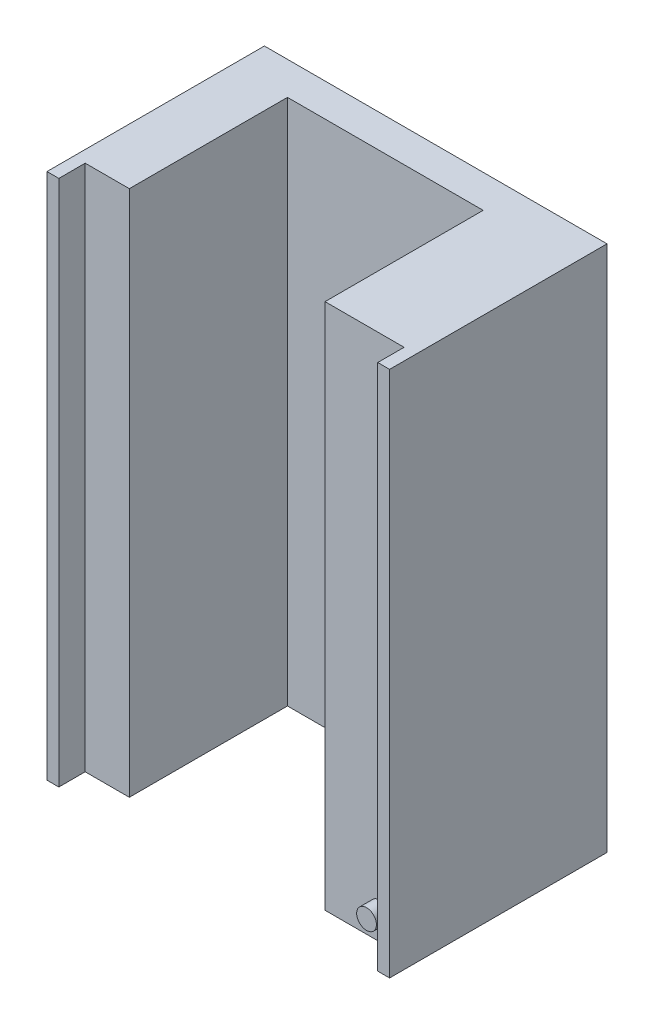
ISO-10303-21;
HEADER;
FILE_DESCRIPTION(('STEP AP214'),'2;1');
FILE_NAME('part.step','',(''),(''),'','','');
FILE_SCHEMA(('AUTOMOTIVE_DESIGN { 1 0 10303 214 1 1 1 1 }'));
ENDSEC;
DATA;
#1=APPLICATION_CONTEXT('core data for automotive mechanical design processes');
#2=APPLICATION_PROTOCOL_DEFINITION('international standard','automotive_design',2000,#1);
#3=PRODUCT_CONTEXT('',#1,'mechanical');
#4=PRODUCT('Part','Part','',(#3));
#5=PRODUCT_RELATED_PRODUCT_CATEGORY('part','',(#4));
#6=PRODUCT_DEFINITION_FORMATION('','',#4);
#7=PRODUCT_DEFINITION_CONTEXT('part definition',#1,'design');
#8=PRODUCT_DEFINITION('design','',#6,#7);
#9=PRODUCT_DEFINITION_SHAPE('','',#8);
#10=(LENGTH_UNIT() NAMED_UNIT(*) SI_UNIT(.MILLI.,.METRE.));
#11=(NAMED_UNIT(*) PLANE_ANGLE_UNIT() SI_UNIT($,.RADIAN.));
#12=(NAMED_UNIT(*) SI_UNIT($,.STERADIAN.) SOLID_ANGLE_UNIT());
#13=UNCERTAINTY_MEASURE_WITH_UNIT(LENGTH_MEASURE(1.E-05),#10,'distance_accuracy_value','');
#14=(GEOMETRIC_REPRESENTATION_CONTEXT(3) GLOBAL_UNCERTAINTY_ASSIGNED_CONTEXT((#13)) GLOBAL_UNIT_ASSIGNED_CONTEXT((#10,
#11,#12)) REPRESENTATION_CONTEXT('',''));
#15=CARTESIAN_POINT('',(0.,0.,0.));
#16=DIRECTION('',(0.,0.,1.));
#17=DIRECTION('',(1.,0.,0.));
#18=AXIS2_PLACEMENT_3D('',#15,#16,#17);
#19=CARTESIAN_POINT('',(-25.,40.,-14.5));
#20=DIRECTION('',(1.,0.,0.));
#21=DIRECTION('',(0.,0.,-1.));
#22=AXIS2_PLACEMENT_3D('',#19,#20,#21);
#23=PLANE('',#22);
#24=DIRECTION('',(0.,0.,1.));
#25=VECTOR('',#24,1.);
#26=CARTESIAN_POINT('',(-25.,0.,-14.5));
#27=LINE('',#26,#25);
#28=CARTESIAN_POINT('',(-25.,0.,-14.5));
#29=VERTEX_POINT('',#28);
#30=CARTESIAN_POINT('',(-25.,0.,2.00000000000001));
#31=VERTEX_POINT('',#30);
#32=EDGE_CURVE('E154',#29,#31,#27,.T.);
#33=ORIENTED_EDGE('',*,*,#32,.T.);
#34=DIRECTION('',(0.,-1.,0.));
#35=VECTOR('',#34,1.);
#36=CARTESIAN_POINT('',(-25.,40.,2.00000000000001));
#37=LINE('',#36,#35);
#38=CARTESIAN_POINT('',(-25.,40.,2.00000000000001));
#39=VERTEX_POINT('',#38);
#40=EDGE_CURVE('E41',#39,#31,#37,.T.);
#41=ORIENTED_EDGE('',*,*,#40,.F.);
#42=DIRECTION('',(0.,0.,1.));
#43=VECTOR('',#42,1.);
#44=CARTESIAN_POINT('',(-25.,40.,-14.5));
#45=LINE('',#44,#43);
#46=CARTESIAN_POINT('',(-25.,40.,-14.5));
#47=VERTEX_POINT('',#46);
#48=EDGE_CURVE('E177',#47,#39,#45,.T.);
#49=ORIENTED_EDGE('',*,*,#48,.F.);
#50=DIRECTION('',(0.,-1.,0.));
#51=VECTOR('',#50,1.);
#52=CARTESIAN_POINT('',(-25.,40.,-14.5));
#53=LINE('',#52,#51);
#54=EDGE_CURVE('E150',#47,#29,#53,.T.);
#55=ORIENTED_EDGE('',*,*,#54,.T.);
#56=EDGE_LOOP('',(#33,#41,#49,#55));
#57=FACE_BOUND('',#56,.T.);
#58=ADVANCED_FACE('F33',(#57),#23,.F.);
#59=CARTESIAN_POINT('',(-24.1,40.,2.00000000000001));
#60=DIRECTION('',(0.,0.,-1.));
#61=DIRECTION('',(-1.,0.,0.));
#62=AXIS2_PLACEMENT_3D('',#59,#60,#61);
#63=PLANE('',#62);
#64=DIRECTION('',(1.,0.,0.));
#65=VECTOR('',#64,1.);
#66=CARTESIAN_POINT('',(-24.1,0.,2.00000000000001));
#67=LINE('',#66,#65);
#68=CARTESIAN_POINT('',(-24.1,0.,2.00000000000001));
#69=VERTEX_POINT('',#68);
#70=EDGE_CURVE('E157',#31,#69,#67,.T.);
#71=ORIENTED_EDGE('',*,*,#70,.T.);
#72=DIRECTION('',(0.,-1.,0.));
#73=VECTOR('',#72,1.);
#74=CARTESIAN_POINT('',(-24.1,40.,2.00000000000001));
#75=LINE('',#74,#73);
#76=CARTESIAN_POINT('',(-24.1,40.,2.00000000000001));
#77=VERTEX_POINT('',#76);
#78=EDGE_CURVE('E199',#77,#69,#75,.T.);
#79=ORIENTED_EDGE('',*,*,#78,.F.);
#80=DIRECTION('',(1.,0.,0.));
#81=VECTOR('',#80,1.);
#82=CARTESIAN_POINT('',(-24.1,40.,2.00000000000001));
#83=LINE('',#82,#81);
#84=EDGE_CURVE('E105',#39,#77,#83,.T.);
#85=ORIENTED_EDGE('',*,*,#84,.F.);
#86=ORIENTED_EDGE('',*,*,#40,.T.);
#87=EDGE_LOOP('',(#71,#79,#85,#86));
#88=FACE_BOUND('',#87,.T.);
#89=ADVANCED_FACE('F202',(#88),#63,.F.);
#90=CARTESIAN_POINT('',(-24.1,40.,0.));
#91=DIRECTION('',(-1.,0.,0.));
#92=DIRECTION('',(0.,0.,1.));
#93=AXIS2_PLACEMENT_3D('',#90,#91,#92);
#94=PLANE('',#93);
#95=DIRECTION('',(0.,0.,-1.));
#96=VECTOR('',#95,1.);
#97=CARTESIAN_POINT('',(-24.1,0.,0.));
#98=LINE('',#97,#96);
#99=CARTESIAN_POINT('',(-24.1,0.,0.));
#100=VERTEX_POINT('',#99);
#101=EDGE_CURVE('E160',#69,#100,#98,.T.);
#102=ORIENTED_EDGE('',*,*,#101,.T.);
#103=DIRECTION('',(0.,-1.,0.));
#104=VECTOR('',#103,1.);
#105=CARTESIAN_POINT('',(-24.1,40.,0.));
#106=LINE('',#105,#104);
#107=CARTESIAN_POINT('',(-24.1,40.,0.));
#108=VERTEX_POINT('',#107);
#109=EDGE_CURVE('E196',#108,#100,#106,.T.);
#110=ORIENTED_EDGE('',*,*,#109,.F.);
#111=DIRECTION('',(0.,0.,-1.));
#112=VECTOR('',#111,1.);
#113=CARTESIAN_POINT('',(-24.1,40.,0.));
#114=LINE('',#113,#112);
#115=EDGE_CURVE('E222',#77,#108,#114,.T.);
#116=ORIENTED_EDGE('',*,*,#115,.F.);
#117=ORIENTED_EDGE('',*,*,#78,.T.);
#118=EDGE_LOOP('',(#102,#110,#116,#117));
#119=FACE_BOUND('',#118,.T.);
#120=ADVANCED_FACE('F213',(#119),#94,.F.);
#121=CARTESIAN_POINT('',(-24.1,40.,0.));
#122=DIRECTION('',(0.,0.,-1.));
#123=DIRECTION('',(-1.,0.,0.));
#124=AXIS2_PLACEMENT_3D('',#121,#122,#123);
#125=PLANE('',#124);
#126=DIRECTION('',(1.,0.,0.));
#127=VECTOR('',#126,1.);
#128=CARTESIAN_POINT('',(-24.1,0.,0.));
#129=LINE('',#128,#127);
#130=CARTESIAN_POINT('',(-20.75,0.,0.));
#131=VERTEX_POINT('',#130);
#132=EDGE_CURVE('E162',#100,#131,#129,.T.);
#133=ORIENTED_EDGE('',*,*,#132,.T.);
#134=DIRECTION('',(0.,-1.,0.));
#135=VECTOR('',#134,1.);
#136=CARTESIAN_POINT('',(-20.75,40.,0.));
#137=LINE('',#136,#135);
#138=CARTESIAN_POINT('',(-20.75,40.,0.));
#139=VERTEX_POINT('',#138);
#140=EDGE_CURVE('E193',#139,#131,#137,.T.);
#141=ORIENTED_EDGE('',*,*,#140,.F.);
#142=DIRECTION('',(1.,0.,0.));
#143=VECTOR('',#142,1.);
#144=CARTESIAN_POINT('',(-24.1,40.,0.));
#145=LINE('',#144,#143);
#146=EDGE_CURVE('E219',#108,#139,#145,.T.);
#147=ORIENTED_EDGE('',*,*,#146,.F.);
#148=ORIENTED_EDGE('',*,*,#109,.T.);
#149=EDGE_LOOP('',(#133,#141,#147,#148));
#150=FACE_BOUND('',#149,.T.);
#151=ADVANCED_FACE('F217',(#150),#125,.F.);
#152=CARTESIAN_POINT('',(-20.75,40.,0.));
#153=DIRECTION('',(-1.,0.,0.));
#154=DIRECTION('',(0.,0.,1.));
#155=AXIS2_PLACEMENT_3D('',#152,#153,#154);
#156=PLANE('',#155);
#157=DIRECTION('',(0.,0.,-1.));
#158=VECTOR('',#157,1.);
#159=CARTESIAN_POINT('',(-20.75,0.,0.));
#160=LINE('',#159,#158);
#161=CARTESIAN_POINT('',(-20.75,0.,-12.));
#162=VERTEX_POINT('',#161);
#163=EDGE_CURVE('E164',#131,#162,#160,.T.);
#164=ORIENTED_EDGE('',*,*,#163,.T.);
#165=DIRECTION('',(0.,-1.,0.));
#166=VECTOR('',#165,1.);
#167=CARTESIAN_POINT('',(-20.75,40.,-12.));
#168=LINE('',#167,#166);
#169=CARTESIAN_POINT('',(-20.75,40.,-12.));
#170=VERTEX_POINT('',#169);
#171=EDGE_CURVE('E190',#170,#162,#168,.T.);
#172=ORIENTED_EDGE('',*,*,#171,.F.);
#173=DIRECTION('',(0.,0.,-1.));
#174=VECTOR('',#173,1.);
#175=CARTESIAN_POINT('',(-20.75,40.,0.));
#176=LINE('',#175,#174);
#177=EDGE_CURVE('E221',#139,#170,#176,.T.);
#178=ORIENTED_EDGE('',*,*,#177,.F.);
#179=ORIENTED_EDGE('',*,*,#140,.T.);
#180=EDGE_LOOP('',(#164,#172,#178,#179));
#181=FACE_BOUND('',#180,.T.);
#182=ADVANCED_FACE('F253',(#181),#156,.F.);
#183=CARTESIAN_POINT('',(-5.90000000000001,40.,-12.));
#184=DIRECTION('',(0.,0.,-1.));
#185=DIRECTION('',(-1.,0.,0.));
#186=AXIS2_PLACEMENT_3D('',#183,#184,#185);
#187=PLANE('',#186);
#188=DIRECTION('',(1.,0.,0.));
#189=VECTOR('',#188,1.);
#190=CARTESIAN_POINT('',(-5.90000000000001,0.,-12.));
#191=LINE('',#190,#189);
#192=CARTESIAN_POINT('',(-5.90000000000001,0.,-12.));
#193=VERTEX_POINT('',#192);
#194=EDGE_CURVE('E166',#162,#193,#191,.T.);
#195=ORIENTED_EDGE('',*,*,#194,.T.);
#196=DIRECTION('',(0.,-1.,0.));
#197=VECTOR('',#196,1.);
#198=CARTESIAN_POINT('',(-5.90000000000001,40.,-12.));
#199=LINE('',#198,#197);
#200=CARTESIAN_POINT('',(-5.90000000000001,40.,-12.));
#201=VERTEX_POINT('',#200);
#202=EDGE_CURVE('E187',#201,#193,#199,.T.);
#203=ORIENTED_EDGE('',*,*,#202,.F.);
#204=DIRECTION('',(1.,0.,0.));
#205=VECTOR('',#204,1.);
#206=CARTESIAN_POINT('',(-5.90000000000001,40.,-12.));
#207=LINE('',#206,#205);
#208=EDGE_CURVE('E224',#170,#201,#207,.T.);
#209=ORIENTED_EDGE('',*,*,#208,.F.);
#210=ORIENTED_EDGE('',*,*,#171,.T.);
#211=EDGE_LOOP('',(#195,#203,#209,#210));
#212=FACE_BOUND('',#211,.T.);
#213=ADVANCED_FACE('F250',(#212),#187,.F.);
#214=CARTESIAN_POINT('',(-5.90000000000001,40.,-12.));
#215=DIRECTION('',(1.,0.,0.));
#216=DIRECTION('',(0.,0.,-1.));
#217=AXIS2_PLACEMENT_3D('',#214,#215,#216);
#218=PLANE('',#217);
#219=DIRECTION('',(0.,0.,1.));
#220=VECTOR('',#219,1.);
#221=CARTESIAN_POINT('',(-5.90000000000001,0.,-12.));
#222=LINE('',#221,#220);
#223=CARTESIAN_POINT('',(-5.9,0.,0.));
#224=VERTEX_POINT('',#223);
#225=EDGE_CURVE('E168',#193,#224,#222,.T.);
#226=ORIENTED_EDGE('',*,*,#225,.T.);
#227=DIRECTION('',(0.,-1.,0.));
#228=VECTOR('',#227,1.);
#229=CARTESIAN_POINT('',(-5.9,40.,0.));
#230=LINE('',#229,#228);
#231=CARTESIAN_POINT('',(-5.9,40.,0.));
#232=VERTEX_POINT('',#231);
#233=EDGE_CURVE('E184',#232,#224,#230,.T.);
#234=ORIENTED_EDGE('',*,*,#233,.F.);
#235=DIRECTION('',(0.,0.,1.));
#236=VECTOR('',#235,1.);
#237=CARTESIAN_POINT('',(-5.90000000000001,40.,-12.));
#238=LINE('',#237,#236);
#239=EDGE_CURVE('E230',#201,#232,#238,.T.);
#240=ORIENTED_EDGE('',*,*,#239,.F.);
#241=ORIENTED_EDGE('',*,*,#202,.T.);
#242=EDGE_LOOP('',(#226,#234,#240,#241));
#243=FACE_BOUND('',#242,.T.);
#244=ADVANCED_FACE('F246',(#243),#218,.F.);
#245=CARTESIAN_POINT('',(-5.9,40.,0.));
#246=DIRECTION('',(0.,0.,-1.));
#247=DIRECTION('',(-1.,0.,0.));
#248=AXIS2_PLACEMENT_3D('',#245,#246,#247);
#249=PLANE('',#248);
#250=CARTESIAN_POINT('',(-1.75,2.,0.));
#251=DIRECTION('',(0.,0.,-1.));
#252=DIRECTION('',(-1.,0.,0.));
#253=AXIS2_PLACEMENT_3D('',#250,#251,#252);
#254=CIRCLE('',#253,0.750000000000001);
#255=CARTESIAN_POINT('',(-2.5,2.,0.));
#256=VERTEX_POINT('',#255);
#257=EDGE_CURVE('E11',#256,#256,#254,.F.);
#258=ORIENTED_EDGE('',*,*,#257,.F.);
#259=EDGE_LOOP('',(#258));
#260=FACE_BOUND('',#259,.T.);
#261=DIRECTION('',(1.,0.,0.));
#262=VECTOR('',#261,1.);
#263=CARTESIAN_POINT('',(-5.9,0.,0.));
#264=LINE('',#263,#262);
#265=CARTESIAN_POINT('',(0.1,0.,0.));
#266=VERTEX_POINT('',#265);
#267=EDGE_CURVE('E170',#224,#266,#264,.T.);
#268=ORIENTED_EDGE('',*,*,#267,.T.);
#269=DIRECTION('',(0.,-1.,0.));
#270=VECTOR('',#269,1.);
#271=CARTESIAN_POINT('',(0.1,40.,0.));
#272=LINE('',#271,#270);
#273=CARTESIAN_POINT('',(0.1,40.,0.));
#274=VERTEX_POINT('',#273);
#275=EDGE_CURVE('E181',#274,#266,#272,.T.);
#276=ORIENTED_EDGE('',*,*,#275,.F.);
#277=DIRECTION('',(1.,0.,0.));
#278=VECTOR('',#277,1.);
#279=CARTESIAN_POINT('',(-5.9,40.,0.));
#280=LINE('',#279,#278);
#281=EDGE_CURVE('E232',#232,#274,#280,.T.);
#282=ORIENTED_EDGE('',*,*,#281,.F.);
#283=ORIENTED_EDGE('',*,*,#233,.T.);
#284=EDGE_LOOP('',(#268,#276,#282,#283));
#285=FACE_BOUND('',#284,.T.);
#286=ADVANCED_FACE('F238',(#260,#285),#249,.F.);
#287=CARTESIAN_POINT('',(0.1,40.,0.));
#288=DIRECTION('',(1.,0.,0.));
#289=DIRECTION('',(0.,0.,-1.));
#290=AXIS2_PLACEMENT_3D('',#287,#288,#289);
#291=PLANE('',#290);
#292=DIRECTION('',(0.,0.,1.));
#293=VECTOR('',#292,1.);
#294=CARTESIAN_POINT('',(0.1,0.,0.));
#295=LINE('',#294,#293);
#296=CARTESIAN_POINT('',(0.1,0.,2.00000000000001));
#297=VERTEX_POINT('',#296);
#298=EDGE_CURVE('E172',#266,#297,#295,.T.);
#299=ORIENTED_EDGE('',*,*,#298,.T.);
#300=DIRECTION('',(0.,-1.,0.));
#301=VECTOR('',#300,1.);
#302=CARTESIAN_POINT('',(0.1,40.,2.00000000000001));
#303=LINE('',#302,#301);
#304=CARTESIAN_POINT('',(0.1,40.,2.00000000000001));
#305=VERTEX_POINT('',#304);
#306=EDGE_CURVE('E145',#305,#297,#303,.T.);
#307=ORIENTED_EDGE('',*,*,#306,.F.);
#308=DIRECTION('',(0.,0.,1.));
#309=VECTOR('',#308,1.);
#310=CARTESIAN_POINT('',(0.1,40.,0.));
#311=LINE('',#310,#309);
#312=EDGE_CURVE('E136',#274,#305,#311,.T.);
#313=ORIENTED_EDGE('',*,*,#312,.F.);
#314=ORIENTED_EDGE('',*,*,#275,.T.);
#315=EDGE_LOOP('',(#299,#307,#313,#314));
#316=FACE_BOUND('',#315,.T.);
#317=ADVANCED_FACE('F242',(#316),#291,.F.);
#318=CARTESIAN_POINT('',(1.,40.,2.00000000000001));
#319=DIRECTION('',(0.,0.,-1.));
#320=DIRECTION('',(-1.,0.,0.));
#321=AXIS2_PLACEMENT_3D('',#318,#319,#320);
#322=PLANE('',#321);
#323=DIRECTION('',(1.,0.,0.));
#324=VECTOR('',#323,1.);
#325=CARTESIAN_POINT('',(1.,0.,2.00000000000001));
#326=LINE('',#325,#324);
#327=CARTESIAN_POINT('',(1.,0.,2.00000000000001));
#328=VERTEX_POINT('',#327);
#329=EDGE_CURVE('E144',#297,#328,#326,.T.);
#330=ORIENTED_EDGE('',*,*,#329,.T.);
#331=DIRECTION('',(0.,-1.,0.));
#332=VECTOR('',#331,1.);
#333=CARTESIAN_POINT('',(1.,40.,2.00000000000001));
#334=LINE('',#333,#332);
#335=CARTESIAN_POINT('',(1.,40.,2.00000000000001));
#336=VERTEX_POINT('',#335);
#337=EDGE_CURVE('E141',#336,#328,#334,.T.);
#338=ORIENTED_EDGE('',*,*,#337,.F.);
#339=DIRECTION('',(1.,0.,0.));
#340=VECTOR('',#339,1.);
#341=CARTESIAN_POINT('',(1.,40.,2.00000000000001));
#342=LINE('',#341,#340);
#343=EDGE_CURVE('E130',#305,#336,#342,.T.);
#344=ORIENTED_EDGE('',*,*,#343,.F.);
#345=ORIENTED_EDGE('',*,*,#306,.T.);
#346=EDGE_LOOP('',(#330,#338,#344,#345));
#347=FACE_BOUND('',#346,.T.);
#348=ADVANCED_FACE('F142',(#347),#322,.F.);
#349=CARTESIAN_POINT('',(1.,40.,2.00000000000001));
#350=DIRECTION('',(-1.,0.,0.));
#351=DIRECTION('',(0.,0.,1.));
#352=AXIS2_PLACEMENT_3D('',#349,#350,#351);
#353=PLANE('',#352);
#354=DIRECTION('',(0.,0.,-1.));
#355=VECTOR('',#354,1.);
#356=CARTESIAN_POINT('',(1.,0.,2.00000000000001));
#357=LINE('',#356,#355);
#358=CARTESIAN_POINT('',(0.999999999999997,0.,-14.5));
#359=VERTEX_POINT('',#358);
#360=EDGE_CURVE('E90',#328,#359,#357,.T.);
#361=ORIENTED_EDGE('',*,*,#360,.T.);
#362=DIRECTION('',(0.,-1.,0.));
#363=VECTOR('',#362,1.);
#364=CARTESIAN_POINT('',(0.999999999999997,40.,-14.5));
#365=LINE('',#364,#363);
#366=CARTESIAN_POINT('',(0.999999999999997,40.,-14.5));
#367=VERTEX_POINT('',#366);
#368=EDGE_CURVE('E146',#367,#359,#365,.T.);
#369=ORIENTED_EDGE('',*,*,#368,.F.);
#370=DIRECTION('',(0.,0.,-1.));
#371=VECTOR('',#370,1.);
#372=CARTESIAN_POINT('',(1.,40.,2.00000000000001));
#373=LINE('',#372,#371);
#374=EDGE_CURVE('E134',#336,#367,#373,.T.);
#375=ORIENTED_EDGE('',*,*,#374,.F.);
#376=ORIENTED_EDGE('',*,*,#337,.T.);
#377=EDGE_LOOP('',(#361,#369,#375,#376));
#378=FACE_BOUND('',#377,.T.);
#379=ADVANCED_FACE('F148',(#378),#353,.F.);
#380=CARTESIAN_POINT('',(0.999999999999997,40.,-14.5));
#381=DIRECTION('',(0.,0.,1.));
#382=DIRECTION('',(1.,0.,0.));
#383=AXIS2_PLACEMENT_3D('',#380,#381,#382);
#384=PLANE('',#383);
#385=DIRECTION('',(-1.,0.,0.));
#386=VECTOR('',#385,1.);
#387=CARTESIAN_POINT('',(0.999999999999997,0.,-14.5));
#388=LINE('',#387,#386);
#389=EDGE_CURVE('E96',#359,#29,#388,.T.);
#390=ORIENTED_EDGE('',*,*,#389,.T.);
#391=ORIENTED_EDGE('',*,*,#54,.F.);
#392=DIRECTION('',(-1.,0.,0.));
#393=VECTOR('',#392,1.);
#394=CARTESIAN_POINT('',(0.999999999999997,40.,-14.5));
#395=LINE('',#394,#393);
#396=EDGE_CURVE('E49',#367,#47,#395,.T.);
#397=ORIENTED_EDGE('',*,*,#396,.F.);
#398=ORIENTED_EDGE('',*,*,#368,.T.);
#399=EDGE_LOOP('',(#390,#391,#397,#398));
#400=FACE_BOUND('',#399,.T.);
#401=ADVANCED_FACE('F321',(#400),#384,.F.);
#402=CARTESIAN_POINT('',(0.,40.,0.));
#403=DIRECTION('',(0.,-1.,0.));
#404=DIRECTION('',(0.,0.,-1.));
#405=AXIS2_PLACEMENT_3D('',#402,#403,#404);
#406=PLANE('',#405);
#407=ORIENTED_EDGE('',*,*,#48,.T.);
#408=ORIENTED_EDGE('',*,*,#84,.T.);
#409=ORIENTED_EDGE('',*,*,#115,.T.);
#410=ORIENTED_EDGE('',*,*,#146,.T.);
#411=ORIENTED_EDGE('',*,*,#177,.T.);
#412=ORIENTED_EDGE('',*,*,#208,.T.);
#413=ORIENTED_EDGE('',*,*,#239,.T.);
#414=ORIENTED_EDGE('',*,*,#281,.T.);
#415=ORIENTED_EDGE('',*,*,#312,.T.);
#416=ORIENTED_EDGE('',*,*,#343,.T.);
#417=ORIENTED_EDGE('',*,*,#374,.T.);
#418=ORIENTED_EDGE('',*,*,#396,.T.);
#419=EDGE_LOOP('',(#407,#408,#409,#410,#411,#412,#413,#414,#415,#416,#417,#418));
#420=FACE_BOUND('',#419,.T.);
#421=ADVANCED_FACE('F132',(#420),#406,.F.);
#422=CARTESIAN_POINT('',(0.,0.,0.));
#423=DIRECTION('',(0.,-1.,0.));
#424=DIRECTION('',(0.,0.,-1.));
#425=AXIS2_PLACEMENT_3D('',#422,#423,#424);
#426=PLANE('',#425);
#427=ORIENTED_EDGE('',*,*,#32,.F.);
#428=ORIENTED_EDGE('',*,*,#389,.F.);
#429=ORIENTED_EDGE('',*,*,#360,.F.);
#430=ORIENTED_EDGE('',*,*,#329,.F.);
#431=ORIENTED_EDGE('',*,*,#298,.F.);
#432=ORIENTED_EDGE('',*,*,#267,.F.);
#433=ORIENTED_EDGE('',*,*,#225,.F.);
#434=ORIENTED_EDGE('',*,*,#194,.F.);
#435=ORIENTED_EDGE('',*,*,#163,.F.);
#436=ORIENTED_EDGE('',*,*,#132,.F.);
#437=ORIENTED_EDGE('',*,*,#101,.F.);
#438=ORIENTED_EDGE('',*,*,#70,.F.);
#439=EDGE_LOOP('',(#427,#428,#429,#430,#431,#432,#433,#434,#435,#436,#437,#438));
#440=FACE_BOUND('',#439,.T.);
#441=ADVANCED_FACE('F207',(#440),#426,.T.);
#442=CARTESIAN_POINT('',(-1.75,2.,1.));
#443=DIRECTION('',(0.,0.,-1.));
#444=DIRECTION('',(-1.,0.,0.));
#445=AXIS2_PLACEMENT_3D('',#442,#443,#444);
#446=CYLINDRICAL_SURFACE('',#445,0.750000000000001);
#447=CARTESIAN_POINT('',(-1.75,2.,1.));
#448=DIRECTION('',(0.,0.,1.));
#449=DIRECTION('',(1.,0.,0.));
#450=AXIS2_PLACEMENT_3D('',#447,#448,#449);
#451=CIRCLE('',#450,0.750000000000001);
#452=CARTESIAN_POINT('',(-1.,2.,1.));
#453=VERTEX_POINT('',#452);
#454=EDGE_CURVE('E158',#453,#453,#451,.T.);
#455=ORIENTED_EDGE('',*,*,#454,.F.);
#456=EDGE_LOOP('',(#455));
#457=FACE_BOUND('',#456,.T.);
#458=ORIENTED_EDGE('',*,*,#257,.T.);
#459=EDGE_LOOP('',(#458));
#460=FACE_BOUND('',#459,.T.);
#461=ADVANCED_FACE('F346',(#457,#460),#446,.T.);
#462=CARTESIAN_POINT('',(-1.75,2.,1.));
#463=DIRECTION('',(0.,0.,1.));
#464=DIRECTION('',(1.,0.,0.));
#465=AXIS2_PLACEMENT_3D('',#462,#463,#464);
#466=PLANE('',#465);
#467=ORIENTED_EDGE('',*,*,#454,.T.);
#468=EDGE_LOOP('',(#467));
#469=FACE_BOUND('',#468,.T.);
#470=ADVANCED_FACE('F362',(#469),#466,.T.);
#471=CLOSED_SHELL('',(#58,#89,#120,#151,#182,#213,#244,#286,#317,#348,#379,#401,#421,#441,#461,#470));
#472=MANIFOLD_SOLID_BREP('B2',#471);
#473=ADVANCED_BREP_SHAPE_REPRESENTATION('',(#18,#472),#14);
#474=SHAPE_DEFINITION_REPRESENTATION(#9,#473);
ENDSEC;
END-ISO-10303-21;
